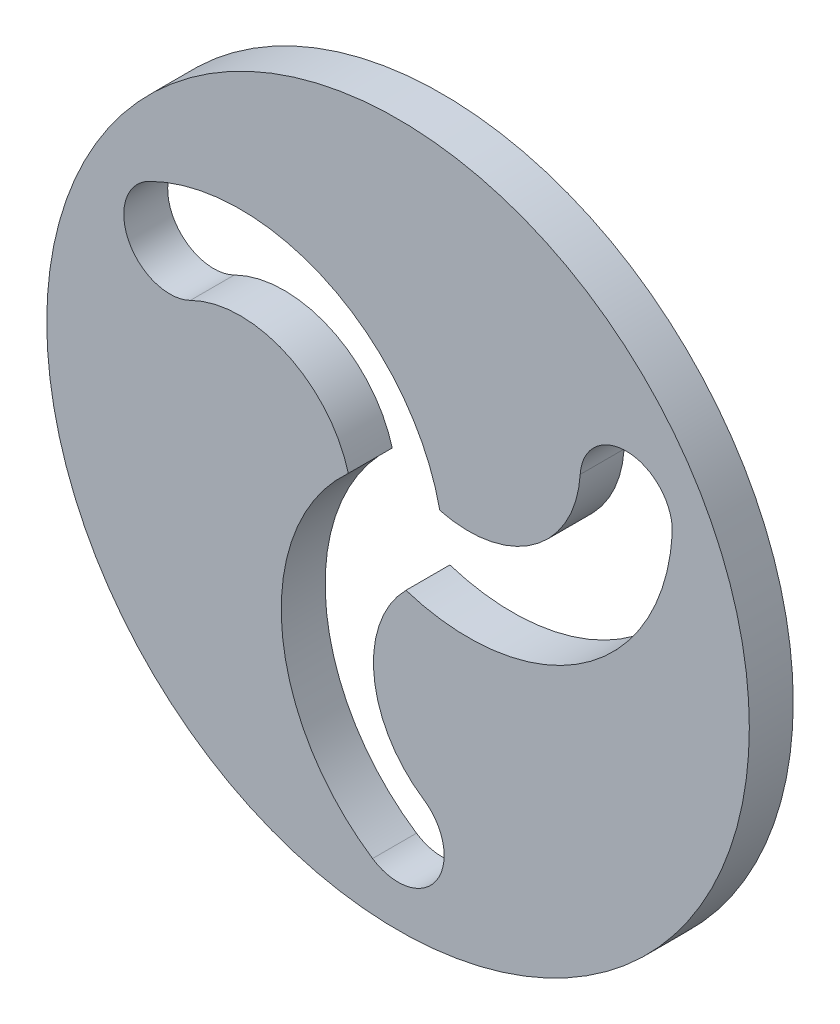
ISO-10303-21;
HEADER;
FILE_DESCRIPTION(('STEP AP214'),'2;1');
FILE_NAME('part.step','',(''),(''),'','','');
FILE_SCHEMA(('AUTOMOTIVE_DESIGN { 1 0 10303 214 1 1 1 1 }'));
ENDSEC;
DATA;
#1=APPLICATION_CONTEXT('core data for automotive mechanical design processes');
#2=APPLICATION_PROTOCOL_DEFINITION('international standard','automotive_design',2000,#1);
#3=PRODUCT_CONTEXT('',#1,'mechanical');
#4=PRODUCT('Part','Part','',(#3));
#5=PRODUCT_RELATED_PRODUCT_CATEGORY('part','',(#4));
#6=PRODUCT_DEFINITION_FORMATION('','',#4);
#7=PRODUCT_DEFINITION_CONTEXT('part definition',#1,'design');
#8=PRODUCT_DEFINITION('design','',#6,#7);
#9=PRODUCT_DEFINITION_SHAPE('','',#8);
#10=(LENGTH_UNIT() NAMED_UNIT(*) SI_UNIT(.MILLI.,.METRE.));
#11=(NAMED_UNIT(*) PLANE_ANGLE_UNIT() SI_UNIT($,.RADIAN.));
#12=(NAMED_UNIT(*) SI_UNIT($,.STERADIAN.) SOLID_ANGLE_UNIT());
#13=UNCERTAINTY_MEASURE_WITH_UNIT(LENGTH_MEASURE(1.E-05),#10,'distance_accuracy_value','');
#14=(GEOMETRIC_REPRESENTATION_CONTEXT(3) GLOBAL_UNCERTAINTY_ASSIGNED_CONTEXT((#13)) GLOBAL_UNIT_ASSIGNED_CONTEXT((#10,
#11,#12)) REPRESENTATION_CONTEXT('',''));
#15=CARTESIAN_POINT('',(0.,0.,0.));
#16=DIRECTION('',(0.,0.,1.));
#17=DIRECTION('',(1.,0.,0.));
#18=AXIS2_PLACEMENT_3D('',#15,#16,#17);
#19=CARTESIAN_POINT('',(0.,0.,5.));
#20=DIRECTION('',(0.,0.,-1.));
#21=DIRECTION('',(-1.,0.,0.));
#22=AXIS2_PLACEMENT_3D('',#19,#20,#21);
#23=CYLINDRICAL_SURFACE('',#22,40.);
#24=CARTESIAN_POINT('',(0.,0.,5.));
#25=DIRECTION('',(0.,0.,1.));
#26=DIRECTION('',(1.,0.,0.));
#27=AXIS2_PLACEMENT_3D('',#24,#25,#26);
#28=CIRCLE('',#27,40.);
#29=CARTESIAN_POINT('',(40.,0.,5.));
#30=VERTEX_POINT('',#29);
#31=EDGE_CURVE('E253',#30,#30,#28,.T.);
#32=ORIENTED_EDGE('',*,*,#31,.F.);
#33=EDGE_LOOP('',(#32));
#34=FACE_BOUND('',#33,.T.);
#35=CARTESIAN_POINT('',(0.,0.,0.));
#36=DIRECTION('',(0.,0.,1.));
#37=DIRECTION('',(1.,0.,0.));
#38=AXIS2_PLACEMENT_3D('',#35,#36,#37);
#39=CIRCLE('',#38,40.);
#40=CARTESIAN_POINT('',(40.,0.,0.));
#41=VERTEX_POINT('',#40);
#42=EDGE_CURVE('E234',#41,#41,#39,.T.);
#43=ORIENTED_EDGE('',*,*,#42,.T.);
#44=EDGE_LOOP('',(#43));
#45=FACE_BOUND('',#44,.T.);
#46=ADVANCED_FACE('F127',(#34,#45),#23,.T.);
#47=CARTESIAN_POINT('',(0.,0.,5.));
#48=DIRECTION('',(0.,0.,1.));
#49=DIRECTION('',(1.,0.,0.));
#50=AXIS2_PLACEMENT_3D('',#47,#48,#49);
#51=PLANE('',#50);
#52=CARTESIAN_POINT('',(-25.9807621135331,15.0000000000001,5.));
#53=DIRECTION('',(0.,0.,1.));
#54=DIRECTION('',(1.,0.,0.));
#55=AXIS2_PLACEMENT_3D('',#52,#53,#54);
#56=CIRCLE('',#55,5.25);
#57=CARTESIAN_POINT('',(-28.3185999093096,19.7007461578604,5.));
#58=VERTEX_POINT('',#57);
#59=CARTESIAN_POINT('',(-23.6429243177567,10.2992538421396,5.));
#60=VERTEX_POINT('',#59);
#61=EDGE_CURVE('E250',#58,#60,#56,.T.);
#62=ORIENTED_EDGE('',*,*,#61,.F.);
#63=CARTESIAN_POINT('',(-17.9653182422997,-1.11684396980705,5.));
#64=DIRECTION('',(0.,0.,1.));
#65=DIRECTION('',(1.,0.,0.));
#66=AXIS2_PLACEMENT_3D('',#63,#64,#65);
#67=CIRCLE('',#66,23.25);
#68=CARTESIAN_POINT('',(4.76118213621191,3.78914018686456,5.));
#69=VERTEX_POINT('',#68);
#70=EDGE_CURVE('E226',#58,#69,#67,.F.);
#71=ORIENTED_EDGE('',*,*,#70,.T.);
#72=CARTESIAN_POINT('',(8.01544387123347,16.116843969807,5.));
#73=DIRECTION('',(0.,0.,1.));
#74=DIRECTION('',(1.,0.,0.));
#75=AXIS2_PLACEMENT_3D('',#72,#73,#74);
#76=CIRCLE('',#75,12.75);
#77=CARTESIAN_POINT('',(20.7408776261957,15.3257461578604,5.));
#78=VERTEX_POINT('',#77);
#79=EDGE_CURVE('E221',#78,#69,#76,.F.);
#80=ORIENTED_EDGE('',*,*,#79,.F.);
#81=CARTESIAN_POINT('',(25.9807621135333,14.9999999999998,5.));
#82=DIRECTION('',(0.,0.,1.));
#83=DIRECTION('',(1.,0.,0.));
#84=AXIS2_PLACEMENT_3D('',#81,#82,#83);
#85=CIRCLE('',#84,5.25);
#86=CARTESIAN_POINT('',(31.2206466008706,14.6742538421396,5.));
#87=VERTEX_POINT('',#86);
#88=EDGE_CURVE('E212',#87,#78,#85,.T.);
#89=ORIENTED_EDGE('',*,*,#88,.F.);
#90=CARTESIAN_POINT('',(8.01544387123347,16.116843969807,5.));
#91=DIRECTION('',(0.,0.,1.));
#92=DIRECTION('',(1.,0.,0.));
#93=AXIS2_PLACEMENT_3D('',#90,#91,#92);
#94=CIRCLE('',#93,23.25);
#95=CARTESIAN_POINT('',(0.900900592219277,-6.01787477543645,5.));
#96=VERTEX_POINT('',#95);
#97=EDGE_CURVE('E219',#87,#96,#94,.F.);
#98=ORIENTED_EDGE('',*,*,#97,.T.);
#99=CARTESIAN_POINT('',(9.9498743710662,-15.,5.));
#100=DIRECTION('',(0.,0.,1.));
#101=DIRECTION('',(1.,0.,0.));
#102=AXIS2_PLACEMENT_3D('',#99,#100,#101);
#103=CIRCLE('',#102,12.75);
#104=CARTESIAN_POINT('',(2.90204669156098,-25.625,5.));
#105=VERTEX_POINT('',#104);
#106=EDGE_CURVE('E200',#105,#96,#103,.F.);
#107=ORIENTED_EDGE('',*,*,#106,.F.);
#108=CARTESIAN_POINT('',(0.,-30.,5.));
#109=DIRECTION('',(0.,0.,1.));
#110=DIRECTION('',(1.,0.,0.));
#111=AXIS2_PLACEMENT_3D('',#108,#109,#110);
#112=CIRCLE('',#111,5.25);
#113=CARTESIAN_POINT('',(-2.90204669156097,-34.375,5.));
#114=VERTEX_POINT('',#113);
#115=EDGE_CURVE('E208',#114,#105,#112,.T.);
#116=ORIENTED_EDGE('',*,*,#115,.F.);
#117=CARTESIAN_POINT('',(9.9498743710662,-15.,5.));
#118=DIRECTION('',(0.,0.,1.));
#119=DIRECTION('',(1.,0.,0.));
#120=AXIS2_PLACEMENT_3D('',#117,#118,#119);
#121=CIRCLE('',#120,23.25);
#122=CARTESIAN_POINT('',(-5.66208272843118,2.22873458857189,5.));
#123=VERTEX_POINT('',#122);
#124=EDGE_CURVE('E141',#114,#123,#121,.F.);
#125=ORIENTED_EDGE('',*,*,#124,.T.);
#126=CARTESIAN_POINT('',(-17.9653182422997,-1.11684396980705,5.));
#127=DIRECTION('',(0.,0.,1.));
#128=DIRECTION('',(1.,0.,0.));
#129=AXIS2_PLACEMENT_3D('',#126,#127,#128);
#130=CIRCLE('',#129,12.75);
#131=EDGE_CURVE('E229',#60,#123,#130,.F.);
#132=ORIENTED_EDGE('',*,*,#131,.F.);
#133=EDGE_LOOP('',(#62,#71,#80,#89,#98,#107,#116,#125,#132));
#134=FACE_BOUND('',#133,.T.);
#135=ORIENTED_EDGE('',*,*,#31,.T.);
#136=EDGE_LOOP('',(#135));
#137=FACE_BOUND('',#136,.T.);
#138=ADVANCED_FACE('F215',(#134,#137),#51,.T.);
#139=CARTESIAN_POINT('',(0.,0.,0.));
#140=DIRECTION('',(0.,0.,1.));
#141=DIRECTION('',(1.,0.,0.));
#142=AXIS2_PLACEMENT_3D('',#139,#140,#141);
#143=PLANE('',#142);
#144=CARTESIAN_POINT('',(-17.9653182422997,-1.11684396980705,0.));
#145=DIRECTION('',(0.,0.,1.));
#146=DIRECTION('',(1.,0.,0.));
#147=AXIS2_PLACEMENT_3D('',#144,#145,#146);
#148=CIRCLE('',#147,23.25);
#149=CARTESIAN_POINT('',(-28.3185999093096,19.7007461578604,0.));
#150=VERTEX_POINT('',#149);
#151=CARTESIAN_POINT('',(4.76118213621191,3.78914018686456,0.));
#152=VERTEX_POINT('',#151);
#153=EDGE_CURVE('E271',#150,#152,#148,.F.);
#154=ORIENTED_EDGE('',*,*,#153,.F.);
#155=CARTESIAN_POINT('',(-25.9807621135331,15.0000000000001,0.));
#156=DIRECTION('',(0.,0.,1.));
#157=DIRECTION('',(1.,0.,0.));
#158=AXIS2_PLACEMENT_3D('',#155,#156,#157);
#159=CIRCLE('',#158,5.25);
#160=CARTESIAN_POINT('',(-23.6429243177567,10.2992538421396,0.));
#161=VERTEX_POINT('',#160);
#162=EDGE_CURVE('E12',#150,#161,#159,.T.);
#163=ORIENTED_EDGE('',*,*,#162,.T.);
#164=CARTESIAN_POINT('',(-17.9653182422997,-1.11684396980705,0.));
#165=DIRECTION('',(0.,0.,1.));
#166=DIRECTION('',(1.,0.,0.));
#167=AXIS2_PLACEMENT_3D('',#164,#165,#166);
#168=CIRCLE('',#167,12.75);
#169=CARTESIAN_POINT('',(-5.66208272843118,2.22873458857189,0.));
#170=VERTEX_POINT('',#169);
#171=EDGE_CURVE('E134',#161,#170,#168,.F.);
#172=ORIENTED_EDGE('',*,*,#171,.T.);
#173=CARTESIAN_POINT('',(9.9498743710662,-15.,0.));
#174=DIRECTION('',(0.,0.,1.));
#175=DIRECTION('',(1.,0.,0.));
#176=AXIS2_PLACEMENT_3D('',#173,#174,#175);
#177=CIRCLE('',#176,23.25);
#178=CARTESIAN_POINT('',(-2.90204669156097,-34.375,0.));
#179=VERTEX_POINT('',#178);
#180=EDGE_CURVE('E263',#179,#170,#177,.F.);
#181=ORIENTED_EDGE('',*,*,#180,.F.);
#182=CARTESIAN_POINT('',(0.,-30.,0.));
#183=DIRECTION('',(0.,0.,1.));
#184=DIRECTION('',(1.,0.,0.));
#185=AXIS2_PLACEMENT_3D('',#182,#183,#184);
#186=CIRCLE('',#185,5.25);
#187=CARTESIAN_POINT('',(2.90204669156098,-25.625,0.));
#188=VERTEX_POINT('',#187);
#189=EDGE_CURVE('E256',#179,#188,#186,.T.);
#190=ORIENTED_EDGE('',*,*,#189,.T.);
#191=CARTESIAN_POINT('',(9.9498743710662,-15.,0.));
#192=DIRECTION('',(0.,0.,1.));
#193=DIRECTION('',(1.,0.,0.));
#194=AXIS2_PLACEMENT_3D('',#191,#192,#193);
#195=CIRCLE('',#194,12.75);
#196=CARTESIAN_POINT('',(0.900900592219277,-6.01787477543645,0.));
#197=VERTEX_POINT('',#196);
#198=EDGE_CURVE('E203',#188,#197,#195,.F.);
#199=ORIENTED_EDGE('',*,*,#198,.T.);
#200=CARTESIAN_POINT('',(8.01544387123347,16.116843969807,0.));
#201=DIRECTION('',(0.,0.,1.));
#202=DIRECTION('',(1.,0.,0.));
#203=AXIS2_PLACEMENT_3D('',#200,#201,#202);
#204=CIRCLE('',#203,23.25);
#205=CARTESIAN_POINT('',(31.2206466008706,14.6742538421396,0.));
#206=VERTEX_POINT('',#205);
#207=EDGE_CURVE('E261',#206,#197,#204,.F.);
#208=ORIENTED_EDGE('',*,*,#207,.F.);
#209=CARTESIAN_POINT('',(25.9807621135333,14.9999999999998,0.));
#210=DIRECTION('',(0.,0.,1.));
#211=DIRECTION('',(1.,0.,0.));
#212=AXIS2_PLACEMENT_3D('',#209,#210,#211);
#213=CIRCLE('',#212,5.25);
#214=CARTESIAN_POINT('',(20.7408776261957,15.3257461578604,0.));
#215=VERTEX_POINT('',#214);
#216=EDGE_CURVE('E265',#206,#215,#213,.T.);
#217=ORIENTED_EDGE('',*,*,#216,.T.);
#218=CARTESIAN_POINT('',(8.01544387123347,16.116843969807,0.));
#219=DIRECTION('',(0.,0.,1.));
#220=DIRECTION('',(1.,0.,0.));
#221=AXIS2_PLACEMENT_3D('',#218,#219,#220);
#222=CIRCLE('',#221,12.75);
#223=EDGE_CURVE('E268',#215,#152,#222,.F.);
#224=ORIENTED_EDGE('',*,*,#223,.T.);
#225=EDGE_LOOP('',(#154,#163,#172,#181,#190,#199,#208,#217,#224));
#226=FACE_BOUND('',#225,.T.);
#227=ORIENTED_EDGE('',*,*,#42,.F.);
#228=EDGE_LOOP('',(#227));
#229=FACE_BOUND('',#228,.T.);
#230=ADVANCED_FACE('F276',(#226,#229),#143,.F.);
#231=CARTESIAN_POINT('',(9.9498743710662,-15.,-5.));
#232=DIRECTION('',(0.,0.,1.));
#233=DIRECTION('',(1.,0.,0.));
#234=AXIS2_PLACEMENT_3D('',#231,#232,#233);
#235=CYLINDRICAL_SURFACE('',#234,23.25);
#236=ORIENTED_EDGE('',*,*,#180,.T.);
#237=DIRECTION('',(0.,0.,1.));
#238=VECTOR('',#237,1.);
#239=CARTESIAN_POINT('',(-5.66208272843118,2.22873458857189,-5.));
#240=LINE('',#239,#238);
#241=EDGE_CURVE('E235',#170,#123,#240,.T.);
#242=ORIENTED_EDGE('',*,*,#241,.T.);
#243=ORIENTED_EDGE('',*,*,#124,.F.);
#244=DIRECTION('',(0.,0.,1.));
#245=VECTOR('',#244,1.);
#246=CARTESIAN_POINT('',(-2.90204669156097,-34.375,-5.));
#247=LINE('',#246,#245);
#248=EDGE_CURVE('E210',#179,#114,#247,.T.);
#249=ORIENTED_EDGE('',*,*,#248,.F.);
#250=EDGE_LOOP('',(#236,#242,#243,#249));
#251=FACE_BOUND('',#250,.T.);
#252=ADVANCED_FACE('F300',(#251),#235,.F.);
#253=CARTESIAN_POINT('',(-17.9653182422997,-1.11684396980705,-5.));
#254=DIRECTION('',(0.,0.,1.));
#255=DIRECTION('',(1.,0.,0.));
#256=AXIS2_PLACEMENT_3D('',#253,#254,#255);
#257=CYLINDRICAL_SURFACE('',#256,12.75);
#258=DIRECTION('',(0.,0.,1.));
#259=VECTOR('',#258,1.);
#260=CARTESIAN_POINT('',(-23.6429243177567,10.2992538421396,-5.));
#261=LINE('',#260,#259);
#262=EDGE_CURVE('E237',#161,#60,#261,.T.);
#263=ORIENTED_EDGE('',*,*,#262,.T.);
#264=ORIENTED_EDGE('',*,*,#131,.T.);
#265=ORIENTED_EDGE('',*,*,#241,.F.);
#266=ORIENTED_EDGE('',*,*,#171,.F.);
#267=EDGE_LOOP('',(#263,#264,#265,#266));
#268=FACE_BOUND('',#267,.T.);
#269=ADVANCED_FACE('F281',(#268),#257,.T.);
#270=CARTESIAN_POINT('',(-17.9653182422997,-1.11684396980705,-5.));
#271=DIRECTION('',(0.,0.,1.));
#272=DIRECTION('',(1.,0.,0.));
#273=AXIS2_PLACEMENT_3D('',#270,#271,#272);
#274=CYLINDRICAL_SURFACE('',#273,23.25);
#275=ORIENTED_EDGE('',*,*,#153,.T.);
#276=DIRECTION('',(0.,0.,1.));
#277=VECTOR('',#276,1.);
#278=CARTESIAN_POINT('',(4.76118213621191,3.78914018686456,-5.));
#279=LINE('',#278,#277);
#280=EDGE_CURVE('E241',#152,#69,#279,.T.);
#281=ORIENTED_EDGE('',*,*,#280,.T.);
#282=ORIENTED_EDGE('',*,*,#70,.F.);
#283=DIRECTION('',(0.,0.,1.));
#284=VECTOR('',#283,1.);
#285=CARTESIAN_POINT('',(-28.3185999093096,19.7007461578604,-5.));
#286=LINE('',#285,#284);
#287=EDGE_CURVE('E239',#150,#58,#286,.T.);
#288=ORIENTED_EDGE('',*,*,#287,.F.);
#289=EDGE_LOOP('',(#275,#281,#282,#288));
#290=FACE_BOUND('',#289,.T.);
#291=ADVANCED_FACE('F289',(#290),#274,.F.);
#292=CARTESIAN_POINT('',(8.01544387123347,16.116843969807,-5.));
#293=DIRECTION('',(0.,0.,1.));
#294=DIRECTION('',(1.,0.,0.));
#295=AXIS2_PLACEMENT_3D('',#292,#293,#294);
#296=CYLINDRICAL_SURFACE('',#295,12.75);
#297=DIRECTION('',(0.,0.,1.));
#298=VECTOR('',#297,1.);
#299=CARTESIAN_POINT('',(20.7408776261957,15.3257461578604,-5.));
#300=LINE('',#299,#298);
#301=EDGE_CURVE('E243',#215,#78,#300,.T.);
#302=ORIENTED_EDGE('',*,*,#301,.T.);
#303=ORIENTED_EDGE('',*,*,#79,.T.);
#304=ORIENTED_EDGE('',*,*,#280,.F.);
#305=ORIENTED_EDGE('',*,*,#223,.F.);
#306=EDGE_LOOP('',(#302,#303,#304,#305));
#307=FACE_BOUND('',#306,.T.);
#308=ADVANCED_FACE('F292',(#307),#296,.T.);
#309=CARTESIAN_POINT('',(8.01544387123347,16.116843969807,-5.));
#310=DIRECTION('',(0.,0.,1.));
#311=DIRECTION('',(1.,0.,0.));
#312=AXIS2_PLACEMENT_3D('',#309,#310,#311);
#313=CYLINDRICAL_SURFACE('',#312,23.25);
#314=ORIENTED_EDGE('',*,*,#207,.T.);
#315=DIRECTION('',(0.,0.,1.));
#316=VECTOR('',#315,1.);
#317=CARTESIAN_POINT('',(0.900900592219277,-6.01787477543645,-5.));
#318=LINE('',#317,#316);
#319=EDGE_CURVE('E205',#197,#96,#318,.T.);
#320=ORIENTED_EDGE('',*,*,#319,.T.);
#321=ORIENTED_EDGE('',*,*,#97,.F.);
#322=DIRECTION('',(0.,0.,1.));
#323=VECTOR('',#322,1.);
#324=CARTESIAN_POINT('',(31.2206466008706,14.6742538421396,-5.));
#325=LINE('',#324,#323);
#326=EDGE_CURVE('E245',#206,#87,#325,.T.);
#327=ORIENTED_EDGE('',*,*,#326,.F.);
#328=EDGE_LOOP('',(#314,#320,#321,#327));
#329=FACE_BOUND('',#328,.T.);
#330=ADVANCED_FACE('F299',(#329),#313,.F.);
#331=CARTESIAN_POINT('',(9.9498743710662,-15.,-5.));
#332=DIRECTION('',(0.,0.,1.));
#333=DIRECTION('',(1.,0.,0.));
#334=AXIS2_PLACEMENT_3D('',#331,#332,#333);
#335=CYLINDRICAL_SURFACE('',#334,12.75);
#336=DIRECTION('',(0.,0.,1.));
#337=VECTOR('',#336,1.);
#338=CARTESIAN_POINT('',(2.90204669156098,-25.625,-5.));
#339=LINE('',#338,#337);
#340=EDGE_CURVE('E149',#188,#105,#339,.T.);
#341=ORIENTED_EDGE('',*,*,#340,.T.);
#342=ORIENTED_EDGE('',*,*,#106,.T.);
#343=ORIENTED_EDGE('',*,*,#319,.F.);
#344=ORIENTED_EDGE('',*,*,#198,.F.);
#345=EDGE_LOOP('',(#341,#342,#343,#344));
#346=FACE_BOUND('',#345,.T.);
#347=ADVANCED_FACE('F197',(#346),#335,.T.);
#348=CARTESIAN_POINT('',(-25.9807621135331,15.0000000000001,-5.));
#349=DIRECTION('',(0.,0.,1.));
#350=DIRECTION('',(1.,0.,0.));
#351=AXIS2_PLACEMENT_3D('',#348,#349,#350);
#352=CYLINDRICAL_SURFACE('',#351,5.25);
#353=ORIENTED_EDGE('',*,*,#287,.T.);
#354=ORIENTED_EDGE('',*,*,#61,.T.);
#355=ORIENTED_EDGE('',*,*,#262,.F.);
#356=ORIENTED_EDGE('',*,*,#162,.F.);
#357=EDGE_LOOP('',(#353,#354,#355,#356));
#358=FACE_BOUND('',#357,.T.);
#359=ADVANCED_FACE('F283',(#358),#352,.F.);
#360=CARTESIAN_POINT('',(25.9807621135333,14.9999999999998,-5.));
#361=DIRECTION('',(0.,0.,1.));
#362=DIRECTION('',(1.,0.,0.));
#363=AXIS2_PLACEMENT_3D('',#360,#361,#362);
#364=CYLINDRICAL_SURFACE('',#363,5.25);
#365=ORIENTED_EDGE('',*,*,#326,.T.);
#366=ORIENTED_EDGE('',*,*,#88,.T.);
#367=ORIENTED_EDGE('',*,*,#301,.F.);
#368=ORIENTED_EDGE('',*,*,#216,.F.);
#369=EDGE_LOOP('',(#365,#366,#367,#368));
#370=FACE_BOUND('',#369,.T.);
#371=ADVANCED_FACE('F295',(#370),#364,.F.);
#372=CARTESIAN_POINT('',(0.,-30.,-5.));
#373=DIRECTION('',(0.,0.,1.));
#374=DIRECTION('',(1.,0.,0.));
#375=AXIS2_PLACEMENT_3D('',#372,#373,#374);
#376=CYLINDRICAL_SURFACE('',#375,5.25);
#377=ORIENTED_EDGE('',*,*,#248,.T.);
#378=ORIENTED_EDGE('',*,*,#115,.T.);
#379=ORIENTED_EDGE('',*,*,#340,.F.);
#380=ORIENTED_EDGE('',*,*,#189,.F.);
#381=EDGE_LOOP('',(#377,#378,#379,#380));
#382=FACE_BOUND('',#381,.T.);
#383=ADVANCED_FACE('F209',(#382),#376,.F.);
#384=CLOSED_SHELL('',(#46,#138,#230,#252,#269,#291,#308,#330,#347,#359,#371,#383));
#385=MANIFOLD_SOLID_BREP('B2',#384);
#386=ADVANCED_BREP_SHAPE_REPRESENTATION('',(#18,#385),#14);
#387=SHAPE_DEFINITION_REPRESENTATION(#9,#386);
ENDSEC;
END-ISO-10303-21;
